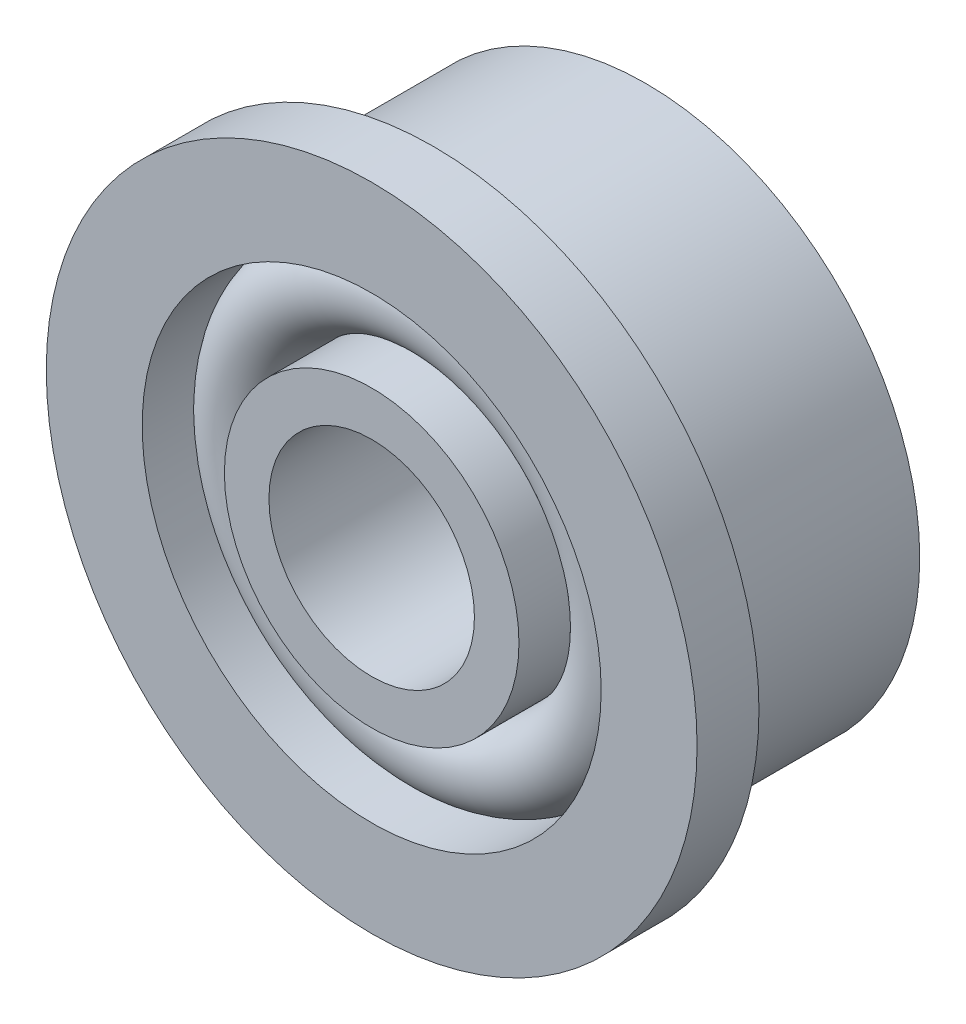
ISO-10303-21;
HEADER;
FILE_DESCRIPTION(('STEP AP214'),'2;1');
FILE_NAME('part.step','',(''),(''),'','','');
FILE_SCHEMA(('AUTOMOTIVE_DESIGN { 1 0 10303 214 1 1 1 1 }'));
ENDSEC;
DATA;
#1=APPLICATION_CONTEXT('core data for automotive mechanical design processes');
#2=APPLICATION_PROTOCOL_DEFINITION('international standard','automotive_design',2000,#1);
#3=PRODUCT_CONTEXT('',#1,'mechanical');
#4=PRODUCT('Part','Part','',(#3));
#5=PRODUCT_RELATED_PRODUCT_CATEGORY('part','',(#4));
#6=PRODUCT_DEFINITION_FORMATION('','',#4);
#7=PRODUCT_DEFINITION_CONTEXT('part definition',#1,'design');
#8=PRODUCT_DEFINITION('design','',#6,#7);
#9=PRODUCT_DEFINITION_SHAPE('','',#8);
#10=(LENGTH_UNIT() NAMED_UNIT(*) SI_UNIT(.MILLI.,.METRE.));
#11=(NAMED_UNIT(*) PLANE_ANGLE_UNIT() SI_UNIT($,.RADIAN.));
#12=(NAMED_UNIT(*) SI_UNIT($,.STERADIAN.) SOLID_ANGLE_UNIT());
#13=UNCERTAINTY_MEASURE_WITH_UNIT(LENGTH_MEASURE(1.E-05),#10,'distance_accuracy_value','');
#14=(GEOMETRIC_REPRESENTATION_CONTEXT(3) GLOBAL_UNCERTAINTY_ASSIGNED_CONTEXT((#13)) GLOBAL_UNIT_ASSIGNED_CONTEXT((#10,
#11,#12)) REPRESENTATION_CONTEXT('',''));
#15=CARTESIAN_POINT('',(0.,0.,0.));
#16=DIRECTION('',(0.,0.,1.));
#17=DIRECTION('',(1.,0.,0.));
#18=AXIS2_PLACEMENT_3D('',#15,#16,#17);
#19=CARTESIAN_POINT('',(0.,2.15,0.));
#20=DIRECTION('',(0.,0.,-1.));
#21=DIRECTION('',(-1.,0.,0.));
#22=AXIS2_PLACEMENT_3D('',#19,#20,#21);
#23=PLANE('',#22);
#24=CARTESIAN_POINT('',(0.,0.,0.));
#25=DIRECTION('',(0.,0.,1.));
#26=DIRECTION('',(1.,0.,0.));
#27=AXIS2_PLACEMENT_3D('',#24,#25,#26);
#28=CIRCLE('',#27,1.5);
#29=CARTESIAN_POINT('',(1.5,0.,0.));
#30=VERTEX_POINT('',#29);
#31=EDGE_CURVE('E10',#30,#30,#28,.T.);
#32=ORIENTED_EDGE('',*,*,#31,.F.);
#33=EDGE_LOOP('',(#32));
#34=FACE_BOUND('',#33,.T.);
#35=CARTESIAN_POINT('',(0.,0.,0.));
#36=DIRECTION('',(0.,0.,1.));
#37=DIRECTION('',(1.,0.,0.));
#38=AXIS2_PLACEMENT_3D('',#35,#36,#37);
#39=CIRCLE('',#38,2.15);
#40=CARTESIAN_POINT('',(2.15,0.,0.));
#41=VERTEX_POINT('',#40);
#42=EDGE_CURVE('E76',#41,#41,#39,.T.);
#43=ORIENTED_EDGE('',*,*,#42,.T.);
#44=EDGE_LOOP('',(#43));
#45=FACE_BOUND('',#44,.T.);
#46=ADVANCED_FACE('F30',(#34,#45),#23,.F.);
#47=CARTESIAN_POINT('',(0.,0.,0.));
#48=DIRECTION('',(0.,0.,1.));
#49=DIRECTION('',(1.,0.,0.));
#50=AXIS2_PLACEMENT_3D('',#47,#48,#49);
#51=CYLINDRICAL_SURFACE('',#50,1.5);
#52=CARTESIAN_POINT('',(0.,0.,-4.));
#53=DIRECTION('',(0.,0.,1.));
#54=DIRECTION('',(1.,0.,0.));
#55=AXIS2_PLACEMENT_3D('',#52,#53,#54);
#56=CIRCLE('',#55,1.5);
#57=CARTESIAN_POINT('',(1.5,0.,-4.));
#58=VERTEX_POINT('',#57);
#59=EDGE_CURVE('E36',#58,#58,#56,.T.);
#60=ORIENTED_EDGE('',*,*,#59,.F.);
#61=EDGE_LOOP('',(#60));
#62=FACE_BOUND('',#61,.T.);
#63=ORIENTED_EDGE('',*,*,#31,.T.);
#64=EDGE_LOOP('',(#63));
#65=FACE_BOUND('',#64,.T.);
#66=ADVANCED_FACE('F149',(#62,#65),#51,.F.);
#67=CARTESIAN_POINT('',(0.,1.5,-4.));
#68=DIRECTION('',(0.,0.,1.));
#69=DIRECTION('',(1.,0.,0.));
#70=AXIS2_PLACEMENT_3D('',#67,#68,#69);
#71=PLANE('',#70);
#72=CARTESIAN_POINT('',(0.,0.,-4.));
#73=DIRECTION('',(0.,0.,1.));
#74=DIRECTION('',(1.,0.,0.));
#75=AXIS2_PLACEMENT_3D('',#72,#73,#74);
#76=CIRCLE('',#75,2.15);
#77=CARTESIAN_POINT('',(2.15,0.,-4.));
#78=VERTEX_POINT('',#77);
#79=EDGE_CURVE('E40',#78,#78,#76,.T.);
#80=ORIENTED_EDGE('',*,*,#79,.F.);
#81=EDGE_LOOP('',(#80));
#82=FACE_BOUND('',#81,.T.);
#83=ORIENTED_EDGE('',*,*,#59,.T.);
#84=EDGE_LOOP('',(#83));
#85=FACE_BOUND('',#84,.T.);
#86=ADVANCED_FACE('F144',(#82,#85),#71,.F.);
#87=CARTESIAN_POINT('',(0.,0.,0.));
#88=DIRECTION('',(0.,0.,1.));
#89=DIRECTION('',(1.,0.,0.));
#90=AXIS2_PLACEMENT_3D('',#87,#88,#89);
#91=CYLINDRICAL_SURFACE('',#90,2.15);
#92=CARTESIAN_POINT('',(0.,0.,-3.));
#93=DIRECTION('',(0.,0.,1.));
#94=DIRECTION('',(1.,0.,0.));
#95=AXIS2_PLACEMENT_3D('',#92,#93,#94);
#96=CIRCLE('',#95,2.15);
#97=CARTESIAN_POINT('',(2.15,0.,-3.));
#98=VERTEX_POINT('',#97);
#99=EDGE_CURVE('E44',#98,#98,#96,.T.);
#100=ORIENTED_EDGE('',*,*,#99,.F.);
#101=EDGE_LOOP('',(#100));
#102=FACE_BOUND('',#101,.T.);
#103=ORIENTED_EDGE('',*,*,#79,.T.);
#104=EDGE_LOOP('',(#103));
#105=FACE_BOUND('',#104,.T.);
#106=ADVANCED_FACE('F138',(#102,#105),#91,.T.);
#107=CARTESIAN_POINT('',(0.,0.,-3.));
#108=DIRECTION('',(0.,0.,1.));
#109=DIRECTION('',(1.,0.,0.));
#110=AXIS2_PLACEMENT_3D('',#107,#108,#109);
#111=TOROIDAL_SURFACE('',#110,2.75,0.6);
#112=CARTESIAN_POINT('',(0.,0.,-3.));
#113=DIRECTION('',(0.,0.,1.));
#114=DIRECTION('',(1.,0.,0.));
#115=AXIS2_PLACEMENT_3D('',#112,#113,#114);
#116=CIRCLE('',#115,3.35);
#117=CARTESIAN_POINT('',(3.35,0.,-3.));
#118=VERTEX_POINT('',#117);
#119=EDGE_CURVE('E49',#118,#118,#116,.T.);
#120=ORIENTED_EDGE('',*,*,#119,.F.);
#121=EDGE_LOOP('',(#120));
#122=FACE_BOUND('',#121,.T.);
#123=ORIENTED_EDGE('',*,*,#99,.T.);
#124=EDGE_LOOP('',(#123));
#125=FACE_BOUND('',#124,.T.);
#126=ADVANCED_FACE('F132',(#122,#125),#111,.T.);
#127=CARTESIAN_POINT('',(0.,0.,0.));
#128=DIRECTION('',(0.,0.,1.));
#129=DIRECTION('',(1.,0.,0.));
#130=AXIS2_PLACEMENT_3D('',#127,#128,#129);
#131=CYLINDRICAL_SURFACE('',#130,3.35);
#132=CARTESIAN_POINT('',(0.,0.,-4.));
#133=DIRECTION('',(0.,0.,1.));
#134=DIRECTION('',(1.,0.,0.));
#135=AXIS2_PLACEMENT_3D('',#132,#133,#134);
#136=CIRCLE('',#135,3.35);
#137=CARTESIAN_POINT('',(3.35,0.,-4.));
#138=VERTEX_POINT('',#137);
#139=EDGE_CURVE('E52',#138,#138,#136,.T.);
#140=ORIENTED_EDGE('',*,*,#139,.F.);
#141=EDGE_LOOP('',(#140));
#142=FACE_BOUND('',#141,.T.);
#143=ORIENTED_EDGE('',*,*,#119,.T.);
#144=EDGE_LOOP('',(#143));
#145=FACE_BOUND('',#144,.T.);
#146=ADVANCED_FACE('F126',(#142,#145),#131,.F.);
#147=CARTESIAN_POINT('',(0.,3.35,-4.));
#148=DIRECTION('',(0.,0.,1.));
#149=DIRECTION('',(1.,0.,0.));
#150=AXIS2_PLACEMENT_3D('',#147,#148,#149);
#151=PLANE('',#150);
#152=CARTESIAN_POINT('',(0.,0.,-4.));
#153=DIRECTION('',(0.,0.,1.));
#154=DIRECTION('',(1.,0.,0.));
#155=AXIS2_PLACEMENT_3D('',#152,#153,#154);
#156=CIRCLE('',#155,4.);
#157=CARTESIAN_POINT('',(4.,0.,-4.));
#158=VERTEX_POINT('',#157);
#159=EDGE_CURVE('E55',#158,#158,#156,.T.);
#160=ORIENTED_EDGE('',*,*,#159,.F.);
#161=EDGE_LOOP('',(#160));
#162=FACE_BOUND('',#161,.T.);
#163=ORIENTED_EDGE('',*,*,#139,.T.);
#164=EDGE_LOOP('',(#163));
#165=FACE_BOUND('',#164,.T.);
#166=ADVANCED_FACE('F120',(#162,#165),#151,.F.);
#167=CARTESIAN_POINT('',(0.,0.,0.));
#168=DIRECTION('',(0.,0.,1.));
#169=DIRECTION('',(1.,0.,0.));
#170=AXIS2_PLACEMENT_3D('',#167,#168,#169);
#171=CYLINDRICAL_SURFACE('',#170,4.);
#172=CARTESIAN_POINT('',(0.,0.,-0.903286234425623));
#173=DIRECTION('',(0.,0.,1.));
#174=DIRECTION('',(1.,0.,0.));
#175=AXIS2_PLACEMENT_3D('',#172,#173,#174);
#176=CIRCLE('',#175,4.);
#177=CARTESIAN_POINT('',(4.,0.,-0.903286234425623));
#178=VERTEX_POINT('',#177);
#179=EDGE_CURVE('E58',#178,#178,#176,.T.);
#180=ORIENTED_EDGE('',*,*,#179,.F.);
#181=EDGE_LOOP('',(#180));
#182=FACE_BOUND('',#181,.T.);
#183=ORIENTED_EDGE('',*,*,#159,.T.);
#184=EDGE_LOOP('',(#183));
#185=FACE_BOUND('',#184,.T.);
#186=ADVANCED_FACE('F114',(#182,#185),#171,.T.);
#187=CARTESIAN_POINT('',(0.,4.,-0.903286234425623));
#188=DIRECTION('',(0.,0.,1.));
#189=DIRECTION('',(1.,0.,0.));
#190=AXIS2_PLACEMENT_3D('',#187,#188,#189);
#191=PLANE('',#190);
#192=CARTESIAN_POINT('',(0.,0.,-0.903286234425623));
#193=DIRECTION('',(0.,0.,1.));
#194=DIRECTION('',(1.,0.,0.));
#195=AXIS2_PLACEMENT_3D('',#192,#193,#194);
#196=CIRCLE('',#195,4.75);
#197=CARTESIAN_POINT('',(4.75,0.,-0.903286234425623));
#198=VERTEX_POINT('',#197);
#199=EDGE_CURVE('E61',#198,#198,#196,.T.);
#200=ORIENTED_EDGE('',*,*,#199,.F.);
#201=EDGE_LOOP('',(#200));
#202=FACE_BOUND('',#201,.T.);
#203=ORIENTED_EDGE('',*,*,#179,.T.);
#204=EDGE_LOOP('',(#203));
#205=FACE_BOUND('',#204,.T.);
#206=ADVANCED_FACE('F108',(#202,#205),#191,.F.);
#207=CARTESIAN_POINT('',(0.,0.,0.));
#208=DIRECTION('',(0.,0.,1.));
#209=DIRECTION('',(1.,0.,0.));
#210=AXIS2_PLACEMENT_3D('',#207,#208,#209);
#211=CYLINDRICAL_SURFACE('',#210,4.75);
#212=CARTESIAN_POINT('',(0.,0.,0.));
#213=DIRECTION('',(0.,0.,1.));
#214=DIRECTION('',(1.,0.,0.));
#215=AXIS2_PLACEMENT_3D('',#212,#213,#214);
#216=CIRCLE('',#215,4.75);
#217=CARTESIAN_POINT('',(4.75,0.,0.));
#218=VERTEX_POINT('',#217);
#219=EDGE_CURVE('E64',#218,#218,#216,.T.);
#220=ORIENTED_EDGE('',*,*,#219,.F.);
#221=EDGE_LOOP('',(#220));
#222=FACE_BOUND('',#221,.T.);
#223=ORIENTED_EDGE('',*,*,#199,.T.);
#224=EDGE_LOOP('',(#223));
#225=FACE_BOUND('',#224,.T.);
#226=ADVANCED_FACE('F102',(#222,#225),#211,.T.);
#227=CARTESIAN_POINT('',(0.,4.75,0.));
#228=DIRECTION('',(0.,0.,-1.));
#229=DIRECTION('',(-1.,0.,0.));
#230=AXIS2_PLACEMENT_3D('',#227,#228,#229);
#231=PLANE('',#230);
#232=CARTESIAN_POINT('',(0.,0.,0.));
#233=DIRECTION('',(0.,0.,1.));
#234=DIRECTION('',(1.,0.,0.));
#235=AXIS2_PLACEMENT_3D('',#232,#233,#234);
#236=CIRCLE('',#235,3.35);
#237=CARTESIAN_POINT('',(3.35,0.,0.));
#238=VERTEX_POINT('',#237);
#239=EDGE_CURVE('E67',#238,#238,#236,.T.);
#240=ORIENTED_EDGE('',*,*,#239,.F.);
#241=EDGE_LOOP('',(#240));
#242=FACE_BOUND('',#241,.T.);
#243=ORIENTED_EDGE('',*,*,#219,.T.);
#244=EDGE_LOOP('',(#243));
#245=FACE_BOUND('',#244,.T.);
#246=ADVANCED_FACE('F96',(#242,#245),#231,.F.);
#247=CARTESIAN_POINT('',(0.,0.,0.));
#248=DIRECTION('',(0.,0.,1.));
#249=DIRECTION('',(1.,0.,0.));
#250=AXIS2_PLACEMENT_3D('',#247,#248,#249);
#251=CYLINDRICAL_SURFACE('',#250,3.35);
#252=CARTESIAN_POINT('',(0.,0.,-1.));
#253=DIRECTION('',(0.,0.,1.));
#254=DIRECTION('',(1.,0.,0.));
#255=AXIS2_PLACEMENT_3D('',#252,#253,#254);
#256=CIRCLE('',#255,3.35);
#257=CARTESIAN_POINT('',(3.35,0.,-1.));
#258=VERTEX_POINT('',#257);
#259=EDGE_CURVE('E70',#258,#258,#256,.T.);
#260=ORIENTED_EDGE('',*,*,#259,.F.);
#261=EDGE_LOOP('',(#260));
#262=FACE_BOUND('',#261,.T.);
#263=ORIENTED_EDGE('',*,*,#239,.T.);
#264=EDGE_LOOP('',(#263));
#265=FACE_BOUND('',#264,.T.);
#266=ADVANCED_FACE('F90',(#262,#265),#251,.F.);
#267=CARTESIAN_POINT('',(0.,0.,-1.));
#268=DIRECTION('',(0.,0.,1.));
#269=DIRECTION('',(1.,0.,0.));
#270=AXIS2_PLACEMENT_3D('',#267,#268,#269);
#271=TOROIDAL_SURFACE('',#270,2.75,0.6);
#272=CARTESIAN_POINT('',(0.,0.,-1.));
#273=DIRECTION('',(0.,0.,1.));
#274=DIRECTION('',(1.,0.,0.));
#275=AXIS2_PLACEMENT_3D('',#272,#273,#274);
#276=CIRCLE('',#275,2.15);
#277=CARTESIAN_POINT('',(2.15,0.,-1.));
#278=VERTEX_POINT('',#277);
#279=EDGE_CURVE('E73',#278,#278,#276,.T.);
#280=ORIENTED_EDGE('',*,*,#279,.F.);
#281=EDGE_LOOP('',(#280));
#282=FACE_BOUND('',#281,.T.);
#283=ORIENTED_EDGE('',*,*,#259,.T.);
#284=EDGE_LOOP('',(#283));
#285=FACE_BOUND('',#284,.T.);
#286=ADVANCED_FACE('F84',(#282,#285),#271,.T.);
#287=CARTESIAN_POINT('',(0.,0.,0.));
#288=DIRECTION('',(0.,0.,1.));
#289=DIRECTION('',(1.,0.,0.));
#290=AXIS2_PLACEMENT_3D('',#287,#288,#289);
#291=CYLINDRICAL_SURFACE('',#290,2.15);
#292=ORIENTED_EDGE('',*,*,#42,.F.);
#293=EDGE_LOOP('',(#292));
#294=FACE_BOUND('',#293,.T.);
#295=ORIENTED_EDGE('',*,*,#279,.T.);
#296=EDGE_LOOP('',(#295));
#297=FACE_BOUND('',#296,.T.);
#298=ADVANCED_FACE('F81',(#294,#297),#291,.T.);
#299=CLOSED_SHELL('',(#46,#66,#86,#106,#126,#146,#166,#186,#206,#226,#246,#266,#286,#298));
#300=MANIFOLD_SOLID_BREP('B2',#299);
#301=ADVANCED_BREP_SHAPE_REPRESENTATION('',(#18,#300),#14);
#302=SHAPE_DEFINITION_REPRESENTATION(#9,#301);
ENDSEC;
END-ISO-10303-21;
